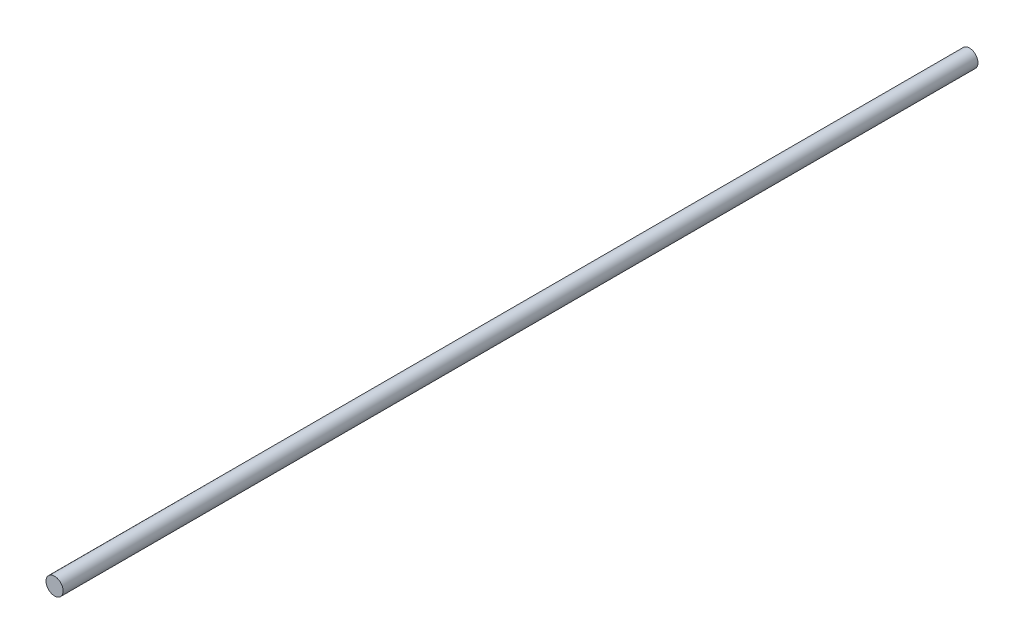
ISO-10303-21;
HEADER;
FILE_DESCRIPTION(('STEP AP214'),'2;1');
FILE_NAME('part.step','',(''),(''),'','','');
FILE_SCHEMA(('AUTOMOTIVE_DESIGN { 1 0 10303 214 1 1 1 1 }'));
ENDSEC;
DATA;
#1=APPLICATION_CONTEXT('core data for automotive mechanical design processes');
#2=APPLICATION_PROTOCOL_DEFINITION('international standard','automotive_design',2000,#1);
#3=PRODUCT_CONTEXT('',#1,'mechanical');
#4=PRODUCT('Part','Part','',(#3));
#5=PRODUCT_RELATED_PRODUCT_CATEGORY('part','',(#4));
#6=PRODUCT_DEFINITION_FORMATION('','',#4);
#7=PRODUCT_DEFINITION_CONTEXT('part definition',#1,'design');
#8=PRODUCT_DEFINITION('design','',#6,#7);
#9=PRODUCT_DEFINITION_SHAPE('','',#8);
#10=(LENGTH_UNIT() NAMED_UNIT(*) SI_UNIT(.MILLI.,.METRE.));
#11=(NAMED_UNIT(*) PLANE_ANGLE_UNIT() SI_UNIT($,.RADIAN.));
#12=(NAMED_UNIT(*) SI_UNIT($,.STERADIAN.) SOLID_ANGLE_UNIT());
#13=UNCERTAINTY_MEASURE_WITH_UNIT(LENGTH_MEASURE(1.E-05),#10,'distance_accuracy_value','');
#14=(GEOMETRIC_REPRESENTATION_CONTEXT(3) GLOBAL_UNCERTAINTY_ASSIGNED_CONTEXT((#13)) GLOBAL_UNIT_ASSIGNED_CONTEXT((#10,
#11,#12)) REPRESENTATION_CONTEXT('',''));
#15=CARTESIAN_POINT('',(0.,0.,0.));
#16=DIRECTION('',(0.,0.,1.));
#17=DIRECTION('',(1.,0.,0.));
#18=AXIS2_PLACEMENT_3D('',#15,#16,#17);
#19=CARTESIAN_POINT('',(0.,0.,508.));
#20=DIRECTION('',(0.,0.,-1.));
#21=DIRECTION('',(-1.,0.,0.));
#22=AXIS2_PLACEMENT_3D('',#19,#20,#21);
#23=CYLINDRICAL_SURFACE('',#22,4.7625);
#24=CARTESIAN_POINT('',(0.,0.,508.));
#25=DIRECTION('',(0.,0.,1.));
#26=DIRECTION('',(1.,0.,0.));
#27=AXIS2_PLACEMENT_3D('',#24,#25,#26);
#28=CIRCLE('',#27,4.7625);
#29=CARTESIAN_POINT('',(4.7625,0.,508.));
#30=VERTEX_POINT('',#29);
#31=EDGE_CURVE('E10',#30,#30,#28,.T.);
#32=ORIENTED_EDGE('',*,*,#31,.F.);
#33=EDGE_LOOP('',(#32));
#34=FACE_BOUND('',#33,.T.);
#35=CARTESIAN_POINT('',(0.,0.,0.));
#36=DIRECTION('',(0.,0.,1.));
#37=DIRECTION('',(1.,0.,0.));
#38=AXIS2_PLACEMENT_3D('',#35,#36,#37);
#39=CIRCLE('',#38,4.7625);
#40=CARTESIAN_POINT('',(4.7625,0.,0.));
#41=VERTEX_POINT('',#40);
#42=EDGE_CURVE('E35',#41,#41,#39,.T.);
#43=ORIENTED_EDGE('',*,*,#42,.T.);
#44=EDGE_LOOP('',(#43));
#45=FACE_BOUND('',#44,.T.);
#46=ADVANCED_FACE('F32',(#34,#45),#23,.T.);
#47=CARTESIAN_POINT('',(0.,0.,508.));
#48=DIRECTION('',(0.,0.,1.));
#49=DIRECTION('',(1.,0.,0.));
#50=AXIS2_PLACEMENT_3D('',#47,#48,#49);
#51=PLANE('',#50);
#52=ORIENTED_EDGE('',*,*,#31,.T.);
#53=EDGE_LOOP('',(#52));
#54=FACE_BOUND('',#53,.T.);
#55=ADVANCED_FACE('F47',(#54),#51,.T.);
#56=CARTESIAN_POINT('',(0.,0.,0.));
#57=DIRECTION('',(0.,0.,1.));
#58=DIRECTION('',(1.,0.,0.));
#59=AXIS2_PLACEMENT_3D('',#56,#57,#58);
#60=PLANE('',#59);
#61=ORIENTED_EDGE('',*,*,#42,.F.);
#62=EDGE_LOOP('',(#61));
#63=FACE_BOUND('',#62,.T.);
#64=ADVANCED_FACE('F45',(#63),#60,.F.);
#65=CLOSED_SHELL('',(#46,#55,#64));
#66=MANIFOLD_SOLID_BREP('B2',#65);
#67=ADVANCED_BREP_SHAPE_REPRESENTATION('',(#18,#66),#14);
#68=SHAPE_DEFINITION_REPRESENTATION(#9,#67);
ENDSEC;
END-ISO-10303-21;
